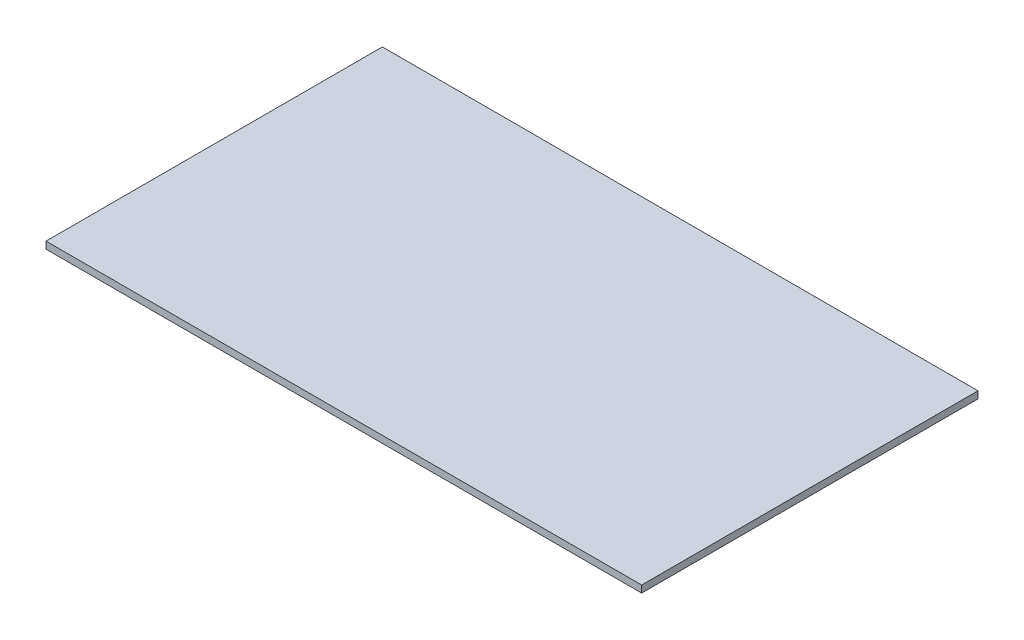
ISO-10303-21;
HEADER;
FILE_DESCRIPTION(('STEP AP214'),'2;1');
FILE_NAME('part.step','',(''),(''),'','','');
FILE_SCHEMA(('AUTOMOTIVE_DESIGN { 1 0 10303 214 1 1 1 1 }'));
ENDSEC;
DATA;
#1=APPLICATION_CONTEXT('core data for automotive mechanical design processes');
#2=APPLICATION_PROTOCOL_DEFINITION('international standard','automotive_design',2000,#1);
#3=PRODUCT_CONTEXT('',#1,'mechanical');
#4=PRODUCT('Part','Part','',(#3));
#5=PRODUCT_RELATED_PRODUCT_CATEGORY('part','',(#4));
#6=PRODUCT_DEFINITION_FORMATION('','',#4);
#7=PRODUCT_DEFINITION_CONTEXT('part definition',#1,'design');
#8=PRODUCT_DEFINITION('design','',#6,#7);
#9=PRODUCT_DEFINITION_SHAPE('','',#8);
#10=(LENGTH_UNIT() NAMED_UNIT(*) SI_UNIT(.MILLI.,.METRE.));
#11=(NAMED_UNIT(*) PLANE_ANGLE_UNIT() SI_UNIT($,.RADIAN.));
#12=(NAMED_UNIT(*) SI_UNIT($,.STERADIAN.) SOLID_ANGLE_UNIT());
#13=UNCERTAINTY_MEASURE_WITH_UNIT(LENGTH_MEASURE(1.E-05),#10,'distance_accuracy_value','');
#14=(GEOMETRIC_REPRESENTATION_CONTEXT(3) GLOBAL_UNCERTAINTY_ASSIGNED_CONTEXT((#13)) GLOBAL_UNIT_ASSIGNED_CONTEXT((#10,
#11,#12)) REPRESENTATION_CONTEXT('',''));
#15=CARTESIAN_POINT('',(0.,0.,0.));
#16=DIRECTION('',(0.,0.,1.));
#17=DIRECTION('',(1.,0.,0.));
#18=AXIS2_PLACEMENT_3D('',#15,#16,#17);
#19=CARTESIAN_POINT('',(42.5,1.,24.));
#20=DIRECTION('',(-1.,0.,0.));
#21=DIRECTION('',(0.,0.,1.));
#22=AXIS2_PLACEMENT_3D('',#19,#20,#21);
#23=PLANE('',#22);
#24=DIRECTION('',(0.,0.,-1.));
#25=VECTOR('',#24,1.);
#26=CARTESIAN_POINT('',(42.5,0.,24.));
#27=LINE('',#26,#25);
#28=CARTESIAN_POINT('',(42.5,0.,24.));
#29=VERTEX_POINT('',#28);
#30=CARTESIAN_POINT('',(42.5,0.,-24.));
#31=VERTEX_POINT('',#30);
#32=EDGE_CURVE('E102',#29,#31,#27,.T.);
#33=ORIENTED_EDGE('',*,*,#32,.T.);
#34=DIRECTION('',(0.,-1.,0.));
#35=VECTOR('',#34,1.);
#36=CARTESIAN_POINT('',(42.5,1.,-24.));
#37=LINE('',#36,#35);
#38=CARTESIAN_POINT('',(42.5,1.,-24.));
#39=VERTEX_POINT('',#38);
#40=EDGE_CURVE('E11',#39,#31,#37,.T.);
#41=ORIENTED_EDGE('',*,*,#40,.F.);
#42=DIRECTION('',(0.,0.,-1.));
#43=VECTOR('',#42,1.);
#44=CARTESIAN_POINT('',(42.5,1.,24.));
#45=LINE('',#44,#43);
#46=CARTESIAN_POINT('',(42.5,1.,24.));
#47=VERTEX_POINT('',#46);
#48=EDGE_CURVE('E90',#47,#39,#45,.T.);
#49=ORIENTED_EDGE('',*,*,#48,.F.);
#50=DIRECTION('',(0.,-1.,0.));
#51=VECTOR('',#50,1.);
#52=CARTESIAN_POINT('',(42.5,1.,24.));
#53=LINE('',#52,#51);
#54=EDGE_CURVE('E98',#47,#29,#53,.T.);
#55=ORIENTED_EDGE('',*,*,#54,.T.);
#56=EDGE_LOOP('',(#33,#41,#49,#55));
#57=FACE_BOUND('',#56,.T.);
#58=ADVANCED_FACE('F39',(#57),#23,.F.);
#59=CARTESIAN_POINT('',(-42.5,1.,-24.));
#60=DIRECTION('',(0.,0.,1.));
#61=DIRECTION('',(1.,0.,0.));
#62=AXIS2_PLACEMENT_3D('',#59,#60,#61);
#63=PLANE('',#62);
#64=DIRECTION('',(-1.,0.,0.));
#65=VECTOR('',#64,1.);
#66=CARTESIAN_POINT('',(-42.5,0.,-24.));
#67=LINE('',#66,#65);
#68=CARTESIAN_POINT('',(-42.5,0.,-24.));
#69=VERTEX_POINT('',#68);
#70=EDGE_CURVE('E94',#31,#69,#67,.T.);
#71=ORIENTED_EDGE('',*,*,#70,.T.);
#72=DIRECTION('',(0.,-1.,0.));
#73=VECTOR('',#72,1.);
#74=CARTESIAN_POINT('',(-42.5,1.,-24.));
#75=LINE('',#74,#73);
#76=CARTESIAN_POINT('',(-42.5,1.,-24.));
#77=VERTEX_POINT('',#76);
#78=EDGE_CURVE('E47',#77,#69,#75,.T.);
#79=ORIENTED_EDGE('',*,*,#78,.F.);
#80=DIRECTION('',(-1.,0.,0.));
#81=VECTOR('',#80,1.);
#82=CARTESIAN_POINT('',(-42.5,1.,-24.));
#83=LINE('',#82,#81);
#84=EDGE_CURVE('E85',#39,#77,#83,.T.);
#85=ORIENTED_EDGE('',*,*,#84,.F.);
#86=ORIENTED_EDGE('',*,*,#40,.T.);
#87=EDGE_LOOP('',(#71,#79,#85,#86));
#88=FACE_BOUND('',#87,.T.);
#89=ADVANCED_FACE('F93',(#88),#63,.F.);
#90=CARTESIAN_POINT('',(-42.5,1.,24.));
#91=DIRECTION('',(1.,0.,0.));
#92=DIRECTION('',(0.,0.,-1.));
#93=AXIS2_PLACEMENT_3D('',#90,#91,#92);
#94=PLANE('',#93);
#95=DIRECTION('',(0.,0.,1.));
#96=VECTOR('',#95,1.);
#97=CARTESIAN_POINT('',(-42.5,0.,24.));
#98=LINE('',#97,#96);
#99=CARTESIAN_POINT('',(-42.5,0.,24.));
#100=VERTEX_POINT('',#99);
#101=EDGE_CURVE('E72',#69,#100,#98,.T.);
#102=ORIENTED_EDGE('',*,*,#101,.T.);
#103=DIRECTION('',(0.,-1.,0.));
#104=VECTOR('',#103,1.);
#105=CARTESIAN_POINT('',(-42.5,1.,24.));
#106=LINE('',#105,#104);
#107=CARTESIAN_POINT('',(-42.5,1.,24.));
#108=VERTEX_POINT('',#107);
#109=EDGE_CURVE('E95',#108,#100,#106,.T.);
#110=ORIENTED_EDGE('',*,*,#109,.F.);
#111=DIRECTION('',(0.,0.,1.));
#112=VECTOR('',#111,1.);
#113=CARTESIAN_POINT('',(-42.5,1.,24.));
#114=LINE('',#113,#112);
#115=EDGE_CURVE('E88',#77,#108,#114,.T.);
#116=ORIENTED_EDGE('',*,*,#115,.F.);
#117=ORIENTED_EDGE('',*,*,#78,.T.);
#118=EDGE_LOOP('',(#102,#110,#116,#117));
#119=FACE_BOUND('',#118,.T.);
#120=ADVANCED_FACE('F96',(#119),#94,.F.);
#121=CARTESIAN_POINT('',(-42.5,1.,24.));
#122=DIRECTION('',(0.,0.,-1.));
#123=DIRECTION('',(-1.,0.,0.));
#124=AXIS2_PLACEMENT_3D('',#121,#122,#123);
#125=PLANE('',#124);
#126=DIRECTION('',(1.,0.,0.));
#127=VECTOR('',#126,1.);
#128=CARTESIAN_POINT('',(-42.5,0.,24.));
#129=LINE('',#128,#127);
#130=EDGE_CURVE('E78',#100,#29,#129,.T.);
#131=ORIENTED_EDGE('',*,*,#130,.T.);
#132=ORIENTED_EDGE('',*,*,#54,.F.);
#133=DIRECTION('',(1.,0.,0.));
#134=VECTOR('',#133,1.);
#135=CARTESIAN_POINT('',(-42.5,1.,24.));
#136=LINE('',#135,#134);
#137=EDGE_CURVE('E55',#108,#47,#136,.T.);
#138=ORIENTED_EDGE('',*,*,#137,.F.);
#139=ORIENTED_EDGE('',*,*,#109,.T.);
#140=EDGE_LOOP('',(#131,#132,#138,#139));
#141=FACE_BOUND('',#140,.T.);
#142=ADVANCED_FACE('F109',(#141),#125,.F.);
#143=CARTESIAN_POINT('',(0.,1.,0.));
#144=DIRECTION('',(0.,-1.,0.));
#145=DIRECTION('',(0.,0.,-1.));
#146=AXIS2_PLACEMENT_3D('',#143,#144,#145);
#147=PLANE('',#146);
#148=ORIENTED_EDGE('',*,*,#48,.T.);
#149=ORIENTED_EDGE('',*,*,#84,.T.);
#150=ORIENTED_EDGE('',*,*,#115,.T.);
#151=ORIENTED_EDGE('',*,*,#137,.T.);
#152=EDGE_LOOP('',(#148,#149,#150,#151));
#153=FACE_BOUND('',#152,.T.);
#154=ADVANCED_FACE('F86',(#153),#147,.F.);
#155=CARTESIAN_POINT('',(0.,0.,0.));
#156=DIRECTION('',(0.,-1.,0.));
#157=DIRECTION('',(0.,0.,-1.));
#158=AXIS2_PLACEMENT_3D('',#155,#156,#157);
#159=PLANE('',#158);
#160=ORIENTED_EDGE('',*,*,#32,.F.);
#161=ORIENTED_EDGE('',*,*,#130,.F.);
#162=ORIENTED_EDGE('',*,*,#101,.F.);
#163=ORIENTED_EDGE('',*,*,#70,.F.);
#164=EDGE_LOOP('',(#160,#161,#162,#163));
#165=FACE_BOUND('',#164,.T.);
#166=ADVANCED_FACE('F112',(#165),#159,.T.);
#167=CLOSED_SHELL('',(#58,#89,#120,#142,#154,#166));
#168=MANIFOLD_SOLID_BREP('B2',#167);
#169=ADVANCED_BREP_SHAPE_REPRESENTATION('',(#18,#168),#14);
#170=SHAPE_DEFINITION_REPRESENTATION(#9,#169);
ENDSEC;
END-ISO-10303-21;
